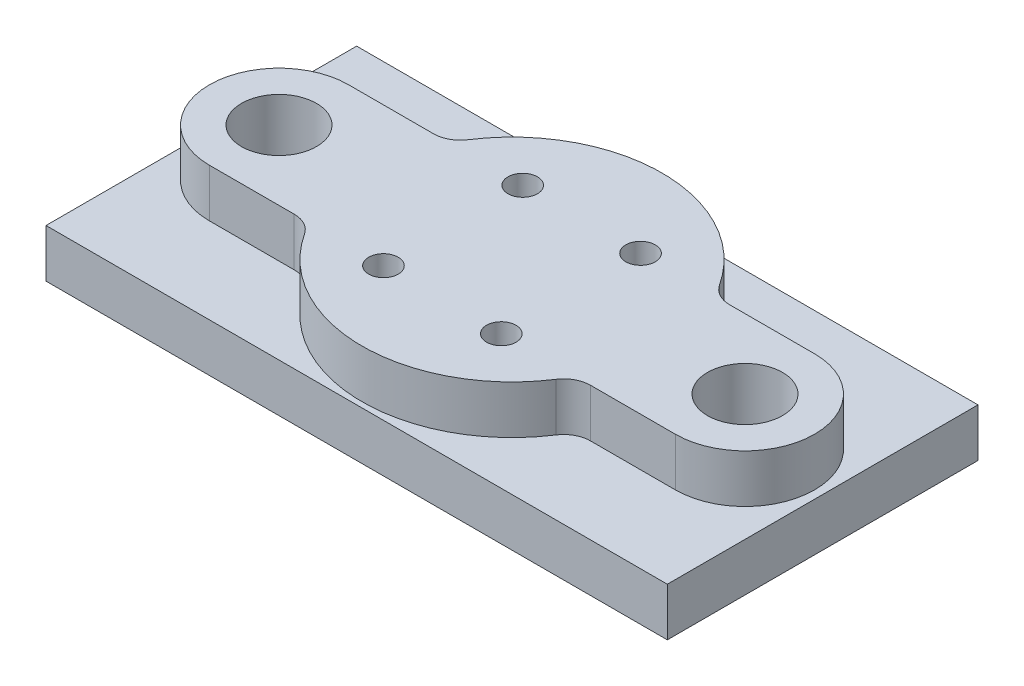
ISO-10303-21;
HEADER;
FILE_DESCRIPTION(('STEP AP214'),'2;1');
FILE_NAME('part.step','',(''),(''),'','','');
FILE_SCHEMA(('AUTOMOTIVE_DESIGN { 1 0 10303 214 1 1 1 1 }'));
ENDSEC;
DATA;
#1=APPLICATION_CONTEXT('core data for automotive mechanical design processes');
#2=APPLICATION_PROTOCOL_DEFINITION('international standard','automotive_design',2000,#1);
#3=PRODUCT_CONTEXT('',#1,'mechanical');
#4=PRODUCT('Part','Part','',(#3));
#5=PRODUCT_RELATED_PRODUCT_CATEGORY('part','',(#4));
#6=PRODUCT_DEFINITION_FORMATION('','',#4);
#7=PRODUCT_DEFINITION_CONTEXT('part definition',#1,'design');
#8=PRODUCT_DEFINITION('design','',#6,#7);
#9=PRODUCT_DEFINITION_SHAPE('','',#8);
#10=(LENGTH_UNIT() NAMED_UNIT(*) SI_UNIT(.MILLI.,.METRE.));
#11=(NAMED_UNIT(*) PLANE_ANGLE_UNIT() SI_UNIT($,.RADIAN.));
#12=(NAMED_UNIT(*) SI_UNIT($,.STERADIAN.) SOLID_ANGLE_UNIT());
#13=UNCERTAINTY_MEASURE_WITH_UNIT(LENGTH_MEASURE(1.E-05),#10,'distance_accuracy_value','');
#14=(GEOMETRIC_REPRESENTATION_CONTEXT(3) GLOBAL_UNCERTAINTY_ASSIGNED_CONTEXT((#13)) GLOBAL_UNIT_ASSIGNED_CONTEXT((#10,
#11,#12)) REPRESENTATION_CONTEXT('',''));
#15=CARTESIAN_POINT('',(0.,0.,0.));
#16=DIRECTION('',(0.,0.,1.));
#17=DIRECTION('',(1.,0.,0.));
#18=AXIS2_PLACEMENT_3D('',#15,#16,#17);
#19=CARTESIAN_POINT('',(-58.,9.,-58.));
#20=DIRECTION('',(-1.,0.,0.));
#21=DIRECTION('',(0.,0.,1.));
#22=AXIS2_PLACEMENT_3D('',#19,#20,#21);
#23=PLANE('',#22);
#24=DIRECTION('',(0.,-1.,0.));
#25=VECTOR('',#24,1.);
#26=CARTESIAN_POINT('',(-58.,9.,0.));
#27=LINE('',#26,#25);
#28=CARTESIAN_POINT('',(-58.,9.,0.));
#29=VERTEX_POINT('',#28);
#30=CARTESIAN_POINT('',(-58.,0.,0.));
#31=VERTEX_POINT('',#30);
#32=EDGE_CURVE('E186',#29,#31,#27,.T.);
#33=ORIENTED_EDGE('',*,*,#32,.F.);
#34=DIRECTION('',(0.,0.,1.));
#35=VECTOR('',#34,1.);
#36=CARTESIAN_POINT('',(-58.,9.,-58.));
#37=LINE('',#36,#35);
#38=CARTESIAN_POINT('',(-58.,9.,-58.));
#39=VERTEX_POINT('',#38);
#40=EDGE_CURVE('E225',#39,#29,#37,.T.);
#41=ORIENTED_EDGE('',*,*,#40,.F.);
#42=DIRECTION('',(0.,-1.,0.));
#43=VECTOR('',#42,1.);
#44=CARTESIAN_POINT('',(-58.,9.,-58.));
#45=LINE('',#44,#43);
#46=CARTESIAN_POINT('',(-58.,0.,-58.));
#47=VERTEX_POINT('',#46);
#48=EDGE_CURVE('E199',#39,#47,#45,.T.);
#49=ORIENTED_EDGE('',*,*,#48,.T.);
#50=DIRECTION('',(0.,0.,1.));
#51=VECTOR('',#50,1.);
#52=CARTESIAN_POINT('',(-58.,0.,-58.));
#53=LINE('',#52,#51);
#54=EDGE_CURVE('E213',#47,#31,#53,.T.);
#55=ORIENTED_EDGE('',*,*,#54,.T.);
#56=EDGE_LOOP('',(#33,#41,#49,#55));
#57=FACE_BOUND('',#56,.T.);
#58=ADVANCED_FACE('F43',(#57),#23,.T.);
#59=CARTESIAN_POINT('',(0.,9.00000000000001,-58.));
#60=DIRECTION('',(0.,1.,0.));
#61=DIRECTION('',(-1.,0.,0.));
#62=AXIS2_PLACEMENT_3D('',#59,#60,#61);
#63=PLANE('',#62);
#64=DIRECTION('',(-1.,0.,0.));
#65=VECTOR('',#64,1.);
#66=CARTESIAN_POINT('',(-43.5,9.00000000000001,-42.));
#67=LINE('',#66,#65);
#68=CARTESIAN_POINT('',(-27.6586333718787,9.00000000000001,-42.));
#69=VERTEX_POINT('',#68);
#70=CARTESIAN_POINT('',(-43.5,9.00000000000001,-42.));
#71=VERTEX_POINT('',#70);
#72=EDGE_CURVE('E313',#69,#71,#67,.T.);
#73=ORIENTED_EDGE('',*,*,#72,.F.);
#74=CARTESIAN_POINT('',(-27.6586333718787,9.,-47.));
#75=DIRECTION('',(0.,1.,0.));
#76=DIRECTION('',(-1.,0.,0.));
#77=AXIS2_PLACEMENT_3D('',#74,#75,#76);
#78=CIRCLE('',#77,5.);
#79=CARTESIAN_POINT('',(-23.4679313458364,9.00000000000001,-44.2727272727273));
#80=VERTEX_POINT('',#79);
#81=EDGE_CURVE('E251',#69,#80,#78,.T.);
#82=ORIENTED_EDGE('',*,*,#81,.T.);
#83=CARTESIAN_POINT('',(0.,9.00000000000001,-29.));
#84=DIRECTION('',(0.,1.,0.));
#85=DIRECTION('',(0.,0.,1.));
#86=AXIS2_PLACEMENT_3D('',#83,#84,#85);
#87=CIRCLE('',#86,28.);
#88=CARTESIAN_POINT('',(23.4679313458364,9.00000000000001,-44.2727272727273));
#89=VERTEX_POINT('',#88);
#90=EDGE_CURVE('E344',#89,#80,#87,.T.);
#91=ORIENTED_EDGE('',*,*,#90,.F.);
#92=CARTESIAN_POINT('',(27.6586333718787,9.00000000000001,-47.));
#93=DIRECTION('',(0.,1.,0.));
#94=DIRECTION('',(-1.,0.,0.));
#95=AXIS2_PLACEMENT_3D('',#92,#93,#94);
#96=CIRCLE('',#95,5.);
#97=CARTESIAN_POINT('',(27.6586333718787,9.00000000000001,-42.));
#98=VERTEX_POINT('',#97);
#99=EDGE_CURVE('E248',#89,#98,#96,.T.);
#100=ORIENTED_EDGE('',*,*,#99,.T.);
#101=DIRECTION('',(-1.,0.,0.));
#102=VECTOR('',#101,1.);
#103=CARTESIAN_POINT('',(43.5,9.00000000000001,-42.));
#104=LINE('',#103,#102);
#105=CARTESIAN_POINT('',(43.5,9.00000000000001,-42.));
#106=VERTEX_POINT('',#105);
#107=EDGE_CURVE('E340',#106,#98,#104,.T.);
#108=ORIENTED_EDGE('',*,*,#107,.F.);
#109=CARTESIAN_POINT('',(43.5,9.00000000000001,-29.));
#110=DIRECTION('',(0.,1.,0.));
#111=DIRECTION('',(0.,0.,-1.));
#112=AXIS2_PLACEMENT_3D('',#109,#110,#111);
#113=CIRCLE('',#112,13.);
#114=CARTESIAN_POINT('',(43.5,9.00000000000001,-16.));
#115=VERTEX_POINT('',#114);
#116=EDGE_CURVE('E184',#115,#106,#113,.T.);
#117=ORIENTED_EDGE('',*,*,#116,.F.);
#118=DIRECTION('',(1.,0.,0.));
#119=VECTOR('',#118,1.);
#120=CARTESIAN_POINT('',(43.5,9.00000000000001,-16.));
#121=LINE('',#120,#119);
#122=CARTESIAN_POINT('',(27.6586333718787,9.00000000000001,-16.));
#123=VERTEX_POINT('',#122);
#124=EDGE_CURVE('E180',#123,#115,#121,.T.);
#125=ORIENTED_EDGE('',*,*,#124,.F.);
#126=CARTESIAN_POINT('',(27.6586333718787,9.00000000000001,-11.));
#127=DIRECTION('',(0.,1.,0.));
#128=DIRECTION('',(-1.,0.,0.));
#129=AXIS2_PLACEMENT_3D('',#126,#127,#128);
#130=CIRCLE('',#129,5.);
#131=CARTESIAN_POINT('',(23.4679313458364,9.00000000000001,-13.7272727272727));
#132=VERTEX_POINT('',#131);
#133=EDGE_CURVE('E242',#123,#132,#130,.T.);
#134=ORIENTED_EDGE('',*,*,#133,.T.);
#135=CARTESIAN_POINT('',(0.,9.00000000000001,-29.));
#136=DIRECTION('',(0.,1.,0.));
#137=DIRECTION('',(0.,0.,1.));
#138=AXIS2_PLACEMENT_3D('',#135,#136,#137);
#139=CIRCLE('',#138,28.);
#140=CARTESIAN_POINT('',(-23.4679313458364,9.00000000000001,-13.7272727272727));
#141=VERTEX_POINT('',#140);
#142=EDGE_CURVE('E303',#141,#132,#139,.T.);
#143=ORIENTED_EDGE('',*,*,#142,.F.);
#144=CARTESIAN_POINT('',(-27.6586333718787,9.,-11.));
#145=DIRECTION('',(0.,1.,0.));
#146=DIRECTION('',(-1.,0.,0.));
#147=AXIS2_PLACEMENT_3D('',#144,#145,#146);
#148=CIRCLE('',#147,5.);
#149=CARTESIAN_POINT('',(-27.6586333718787,9.00000000000001,-16.));
#150=VERTEX_POINT('',#149);
#151=EDGE_CURVE('E245',#141,#150,#148,.T.);
#152=ORIENTED_EDGE('',*,*,#151,.T.);
#153=DIRECTION('',(1.,0.,0.));
#154=VECTOR('',#153,1.);
#155=CARTESIAN_POINT('',(-43.5,9.00000000000001,-16.));
#156=LINE('',#155,#154);
#157=CARTESIAN_POINT('',(-43.5,9.00000000000001,-16.));
#158=VERTEX_POINT('',#157);
#159=EDGE_CURVE('E301',#158,#150,#156,.T.);
#160=ORIENTED_EDGE('',*,*,#159,.F.);
#161=CARTESIAN_POINT('',(-43.5,9.00000000000001,-29.));
#162=DIRECTION('',(0.,1.,0.));
#163=DIRECTION('',(0.,0.,-1.));
#164=AXIS2_PLACEMENT_3D('',#161,#162,#163);
#165=CIRCLE('',#164,13.);
#166=EDGE_CURVE('E308',#71,#158,#165,.T.);
#167=ORIENTED_EDGE('',*,*,#166,.F.);
#168=EDGE_LOOP('',(#73,#82,#91,#100,#108,#117,#125,#134,#143,#152,#160,#167));
#169=FACE_BOUND('',#168,.T.);
#170=DIRECTION('',(-1.,0.,0.));
#171=VECTOR('',#170,1.);
#172=CARTESIAN_POINT('',(0.,9.00000000000001,0.));
#173=LINE('',#172,#171);
#174=CARTESIAN_POINT('',(58.,9.00000000000001,0.));
#175=VERTEX_POINT('',#174);
#176=EDGE_CURVE('E204',#175,#29,#173,.T.);
#177=ORIENTED_EDGE('',*,*,#176,.F.);
#178=DIRECTION('',(0.,0.,1.));
#179=VECTOR('',#178,1.);
#180=CARTESIAN_POINT('',(58.,9.00000000000001,-58.));
#181=LINE('',#180,#179);
#182=CARTESIAN_POINT('',(58.,9.00000000000001,-58.));
#183=VERTEX_POINT('',#182);
#184=EDGE_CURVE('E229',#183,#175,#181,.T.);
#185=ORIENTED_EDGE('',*,*,#184,.F.);
#186=DIRECTION('',(-1.,0.,0.));
#187=VECTOR('',#186,1.);
#188=CARTESIAN_POINT('',(58.,9.00000000000001,-58.));
#189=LINE('',#188,#187);
#190=EDGE_CURVE('E211',#183,#39,#189,.T.);
#191=ORIENTED_EDGE('',*,*,#190,.T.);
#192=ORIENTED_EDGE('',*,*,#40,.T.);
#193=EDGE_LOOP('',(#177,#185,#191,#192));
#194=FACE_BOUND('',#193,.T.);
#195=ADVANCED_FACE('F298',(#169,#194),#63,.T.);
#196=CARTESIAN_POINT('',(58.,0.,-58.));
#197=DIRECTION('',(1.,0.,0.));
#198=DIRECTION('',(0.,1.,0.));
#199=AXIS2_PLACEMENT_3D('',#196,#197,#198);
#200=PLANE('',#199);
#201=DIRECTION('',(0.,1.,0.));
#202=VECTOR('',#201,1.);
#203=CARTESIAN_POINT('',(58.,0.,0.));
#204=LINE('',#203,#202);
#205=CARTESIAN_POINT('',(58.,0.,0.));
#206=VERTEX_POINT('',#205);
#207=EDGE_CURVE('E218',#206,#175,#204,.T.);
#208=ORIENTED_EDGE('',*,*,#207,.F.);
#209=DIRECTION('',(0.,0.,1.));
#210=VECTOR('',#209,1.);
#211=CARTESIAN_POINT('',(58.,0.,-58.));
#212=LINE('',#211,#210);
#213=CARTESIAN_POINT('',(58.,0.,-58.));
#214=VERTEX_POINT('',#213);
#215=EDGE_CURVE('E233',#214,#206,#212,.T.);
#216=ORIENTED_EDGE('',*,*,#215,.F.);
#217=DIRECTION('',(0.,1.,0.));
#218=VECTOR('',#217,1.);
#219=CARTESIAN_POINT('',(58.,0.,-58.));
#220=LINE('',#219,#218);
#221=EDGE_CURVE('E207',#214,#183,#220,.T.);
#222=ORIENTED_EDGE('',*,*,#221,.T.);
#223=ORIENTED_EDGE('',*,*,#184,.T.);
#224=EDGE_LOOP('',(#208,#216,#222,#223));
#225=FACE_BOUND('',#224,.T.);
#226=ADVANCED_FACE('F385',(#225),#200,.T.);
#227=CARTESIAN_POINT('',(0.,0.,-58.));
#228=DIRECTION('',(0.,-1.,0.));
#229=DIRECTION('',(0.,0.,-1.));
#230=AXIS2_PLACEMENT_3D('',#227,#228,#229);
#231=PLANE('',#230);
#232=CARTESIAN_POINT('',(11.,0.,-42.));
#233=DIRECTION('',(0.,-1.,0.));
#234=DIRECTION('',(0.,0.,-1.));
#235=AXIS2_PLACEMENT_3D('',#232,#233,#234);
#236=CIRCLE('',#235,4.75);
#237=CARTESIAN_POINT('',(11.,0.,-46.75));
#238=VERTEX_POINT('',#237);
#239=EDGE_CURVE('E759',#238,#238,#236,.T.);
#240=ORIENTED_EDGE('',*,*,#239,.F.);
#241=EDGE_LOOP('',(#240));
#242=FACE_BOUND('',#241,.T.);
#243=CARTESIAN_POINT('',(11.,0.,-16.));
#244=DIRECTION('',(0.,-1.,0.));
#245=DIRECTION('',(0.,0.,-1.));
#246=AXIS2_PLACEMENT_3D('',#243,#244,#245);
#247=CIRCLE('',#246,4.75);
#248=CARTESIAN_POINT('',(11.,0.,-20.75));
#249=VERTEX_POINT('',#248);
#250=EDGE_CURVE('E764',#249,#249,#247,.T.);
#251=ORIENTED_EDGE('',*,*,#250,.F.);
#252=EDGE_LOOP('',(#251));
#253=FACE_BOUND('',#252,.T.);
#254=CARTESIAN_POINT('',(-11.,0.,-16.));
#255=DIRECTION('',(0.,-1.,0.));
#256=DIRECTION('',(0.,0.,-1.));
#257=AXIS2_PLACEMENT_3D('',#254,#255,#256);
#258=CIRCLE('',#257,4.75);
#259=CARTESIAN_POINT('',(-11.,0.,-20.75));
#260=VERTEX_POINT('',#259);
#261=EDGE_CURVE('E788',#260,#260,#258,.T.);
#262=ORIENTED_EDGE('',*,*,#261,.F.);
#263=EDGE_LOOP('',(#262));
#264=FACE_BOUND('',#263,.T.);
#265=CARTESIAN_POINT('',(-11.,0.,-42.));
#266=DIRECTION('',(0.,-1.,0.));
#267=DIRECTION('',(0.,0.,-1.));
#268=AXIS2_PLACEMENT_3D('',#265,#266,#267);
#269=CIRCLE('',#268,4.75);
#270=CARTESIAN_POINT('',(-11.,0.,-46.75));
#271=VERTEX_POINT('',#270);
#272=EDGE_CURVE('E778',#271,#271,#269,.T.);
#273=ORIENTED_EDGE('',*,*,#272,.F.);
#274=EDGE_LOOP('',(#273));
#275=FACE_BOUND('',#274,.T.);
#276=CARTESIAN_POINT('',(-43.5,0.,-29.));
#277=DIRECTION('',(0.,1.,0.));
#278=DIRECTION('',(0.,0.,1.));
#279=AXIS2_PLACEMENT_3D('',#276,#277,#278);
#280=CIRCLE('',#279,6.99999999999999);
#281=CARTESIAN_POINT('',(-43.5,0.,-22.));
#282=VERTEX_POINT('',#281);
#283=EDGE_CURVE('E809',#282,#282,#280,.T.);
#284=ORIENTED_EDGE('',*,*,#283,.T.);
#285=EDGE_LOOP('',(#284));
#286=FACE_BOUND('',#285,.T.);
#287=CARTESIAN_POINT('',(43.5,0.,-29.));
#288=DIRECTION('',(0.,1.,0.));
#289=DIRECTION('',(0.,0.,1.));
#290=AXIS2_PLACEMENT_3D('',#287,#288,#289);
#291=CIRCLE('',#290,6.99999999999999);
#292=CARTESIAN_POINT('',(43.5,0.,-22.));
#293=VERTEX_POINT('',#292);
#294=EDGE_CURVE('E801',#293,#293,#291,.T.);
#295=ORIENTED_EDGE('',*,*,#294,.T.);
#296=EDGE_LOOP('',(#295));
#297=FACE_BOUND('',#296,.T.);
#298=DIRECTION('',(1.,0.,0.));
#299=VECTOR('',#298,1.);
#300=CARTESIAN_POINT('',(0.,0.,0.));
#301=LINE('',#300,#299);
#302=EDGE_CURVE('E192',#31,#206,#301,.T.);
#303=ORIENTED_EDGE('',*,*,#302,.F.);
#304=ORIENTED_EDGE('',*,*,#54,.F.);
#305=DIRECTION('',(1.,0.,0.));
#306=VECTOR('',#305,1.);
#307=CARTESIAN_POINT('',(-58.,0.,-58.));
#308=LINE('',#307,#306);
#309=EDGE_CURVE('E203',#47,#214,#308,.T.);
#310=ORIENTED_EDGE('',*,*,#309,.T.);
#311=ORIENTED_EDGE('',*,*,#215,.T.);
#312=EDGE_LOOP('',(#303,#304,#310,#311));
#313=FACE_BOUND('',#312,.T.);
#314=ADVANCED_FACE('F390',(#242,#253,#264,#275,#286,#297,#313),#231,.T.);
#315=CARTESIAN_POINT('',(0.,0.,-58.));
#316=DIRECTION('',(0.,0.,1.));
#317=DIRECTION('',(1.,0.,0.));
#318=AXIS2_PLACEMENT_3D('',#315,#316,#317);
#319=PLANE('',#318);
#320=ORIENTED_EDGE('',*,*,#48,.F.);
#321=ORIENTED_EDGE('',*,*,#190,.F.);
#322=ORIENTED_EDGE('',*,*,#221,.F.);
#323=ORIENTED_EDGE('',*,*,#309,.F.);
#324=EDGE_LOOP('',(#320,#321,#322,#323));
#325=FACE_BOUND('',#324,.T.);
#326=ADVANCED_FACE('F455',(#325),#319,.F.);
#327=CARTESIAN_POINT('',(0.,0.,0.));
#328=DIRECTION('',(0.,0.,1.));
#329=DIRECTION('',(1.,0.,0.));
#330=AXIS2_PLACEMENT_3D('',#327,#328,#329);
#331=PLANE('',#330);
#332=ORIENTED_EDGE('',*,*,#32,.T.);
#333=ORIENTED_EDGE('',*,*,#302,.T.);
#334=ORIENTED_EDGE('',*,*,#207,.T.);
#335=ORIENTED_EDGE('',*,*,#176,.T.);
#336=EDGE_LOOP('',(#332,#333,#334,#335));
#337=FACE_BOUND('',#336,.T.);
#338=ADVANCED_FACE('F421',(#337),#331,.T.);
#339=CARTESIAN_POINT('',(43.5,18.,-29.));
#340=DIRECTION('',(0.,-1.,0.));
#341=DIRECTION('',(0.,0.,-1.));
#342=AXIS2_PLACEMENT_3D('',#339,#340,#341);
#343=PLANE('',#342);
#344=CARTESIAN_POINT('',(-43.5,18.,-29.));
#345=DIRECTION('',(0.,1.,0.));
#346=DIRECTION('',(0.,0.,1.));
#347=AXIS2_PLACEMENT_3D('',#344,#345,#346);
#348=CIRCLE('',#347,6.99999999999999);
#349=CARTESIAN_POINT('',(-43.5,18.,-22.));
#350=VERTEX_POINT('',#349);
#351=EDGE_CURVE('E777',#350,#350,#348,.T.);
#352=ORIENTED_EDGE('',*,*,#351,.F.);
#353=EDGE_LOOP('',(#352));
#354=FACE_BOUND('',#353,.T.);
#355=CARTESIAN_POINT('',(43.5,18.,-29.));
#356=DIRECTION('',(0.,1.,0.));
#357=DIRECTION('',(0.,0.,1.));
#358=AXIS2_PLACEMENT_3D('',#355,#356,#357);
#359=CIRCLE('',#358,6.99999999999999);
#360=CARTESIAN_POINT('',(43.5,18.,-22.));
#361=VERTEX_POINT('',#360);
#362=EDGE_CURVE('E805',#361,#361,#359,.T.);
#363=ORIENTED_EDGE('',*,*,#362,.F.);
#364=EDGE_LOOP('',(#363));
#365=FACE_BOUND('',#364,.T.);
#366=CARTESIAN_POINT('',(43.5,18.,-29.));
#367=DIRECTION('',(0.,1.,0.));
#368=DIRECTION('',(0.,0.,-1.));
#369=AXIS2_PLACEMENT_3D('',#366,#367,#368);
#370=CIRCLE('',#369,13.);
#371=CARTESIAN_POINT('',(43.5,18.,-16.));
#372=VERTEX_POINT('',#371);
#373=CARTESIAN_POINT('',(43.5,18.,-42.));
#374=VERTEX_POINT('',#373);
#375=EDGE_CURVE('E170',#372,#374,#370,.T.);
#376=ORIENTED_EDGE('',*,*,#375,.T.);
#377=DIRECTION('',(-1.,0.,0.));
#378=VECTOR('',#377,1.);
#379=CARTESIAN_POINT('',(43.5,18.,-42.));
#380=LINE('',#379,#378);
#381=CARTESIAN_POINT('',(27.6586333718787,18.,-42.));
#382=VERTEX_POINT('',#381);
#383=EDGE_CURVE('E158',#374,#382,#380,.T.);
#384=ORIENTED_EDGE('',*,*,#383,.T.);
#385=CARTESIAN_POINT('',(27.6586333718787,18.,-47.));
#386=DIRECTION('',(0.,-1.,0.));
#387=DIRECTION('',(0.,0.,-1.));
#388=AXIS2_PLACEMENT_3D('',#385,#386,#387);
#389=CIRCLE('',#388,5.);
#390=CARTESIAN_POINT('',(23.4679313458364,18.,-44.2727272727273));
#391=VERTEX_POINT('',#390);
#392=EDGE_CURVE('E279',#382,#391,#389,.T.);
#393=ORIENTED_EDGE('',*,*,#392,.T.);
#394=CARTESIAN_POINT('',(0.,18.,-29.));
#395=DIRECTION('',(0.,1.,0.));
#396=DIRECTION('',(0.,0.,1.));
#397=AXIS2_PLACEMENT_3D('',#394,#395,#396);
#398=CIRCLE('',#397,28.);
#399=CARTESIAN_POINT('',(-23.4679313458364,18.,-44.2727272727273));
#400=VERTEX_POINT('',#399);
#401=EDGE_CURVE('E169',#391,#400,#398,.T.);
#402=ORIENTED_EDGE('',*,*,#401,.T.);
#403=CARTESIAN_POINT('',(-27.6586333718787,18.,-47.));
#404=DIRECTION('',(0.,-1.,0.));
#405=DIRECTION('',(0.,0.,-1.));
#406=AXIS2_PLACEMENT_3D('',#403,#404,#405);
#407=CIRCLE('',#406,5.);
#408=CARTESIAN_POINT('',(-27.6586333718787,18.,-42.));
#409=VERTEX_POINT('',#408);
#410=EDGE_CURVE('E276',#400,#409,#407,.T.);
#411=ORIENTED_EDGE('',*,*,#410,.T.);
#412=DIRECTION('',(-1.,0.,0.));
#413=VECTOR('',#412,1.);
#414=CARTESIAN_POINT('',(-43.5,18.,-42.));
#415=LINE('',#414,#413);
#416=CARTESIAN_POINT('',(-43.5,18.,-42.));
#417=VERTEX_POINT('',#416);
#418=EDGE_CURVE('E329',#409,#417,#415,.T.);
#419=ORIENTED_EDGE('',*,*,#418,.T.);
#420=CARTESIAN_POINT('',(-43.5,18.,-29.));
#421=DIRECTION('',(0.,1.,0.));
#422=DIRECTION('',(0.,0.,-1.));
#423=AXIS2_PLACEMENT_3D('',#420,#421,#422);
#424=CIRCLE('',#423,13.);
#425=CARTESIAN_POINT('',(-43.5,18.,-16.));
#426=VERTEX_POINT('',#425);
#427=EDGE_CURVE('E326',#417,#426,#424,.T.);
#428=ORIENTED_EDGE('',*,*,#427,.T.);
#429=DIRECTION('',(1.,0.,0.));
#430=VECTOR('',#429,1.);
#431=CARTESIAN_POINT('',(-43.5,18.,-16.));
#432=LINE('',#431,#430);
#433=CARTESIAN_POINT('',(-27.6586333718787,18.,-16.));
#434=VERTEX_POINT('',#433);
#435=EDGE_CURVE('E285',#426,#434,#432,.T.);
#436=ORIENTED_EDGE('',*,*,#435,.T.);
#437=CARTESIAN_POINT('',(-27.6586333718787,18.,-11.));
#438=DIRECTION('',(0.,-1.,0.));
#439=DIRECTION('',(0.,0.,-1.));
#440=AXIS2_PLACEMENT_3D('',#437,#438,#439);
#441=CIRCLE('',#440,5.);
#442=CARTESIAN_POINT('',(-23.4679313458364,18.,-13.7272727272727));
#443=VERTEX_POINT('',#442);
#444=EDGE_CURVE('E52',#434,#443,#441,.T.);
#445=ORIENTED_EDGE('',*,*,#444,.T.);
#446=CARTESIAN_POINT('',(0.,18.,-29.));
#447=DIRECTION('',(0.,1.,0.));
#448=DIRECTION('',(0.,0.,1.));
#449=AXIS2_PLACEMENT_3D('',#446,#447,#448);
#450=CIRCLE('',#449,28.);
#451=CARTESIAN_POINT('',(23.4679313458364,18.,-13.7272727272727));
#452=VERTEX_POINT('',#451);
#453=EDGE_CURVE('E284',#443,#452,#450,.T.);
#454=ORIENTED_EDGE('',*,*,#453,.T.);
#455=CARTESIAN_POINT('',(27.6586333718787,18.,-11.));
#456=DIRECTION('',(0.,-1.,0.));
#457=DIRECTION('',(0.,0.,-1.));
#458=AXIS2_PLACEMENT_3D('',#455,#456,#457);
#459=CIRCLE('',#458,5.);
#460=CARTESIAN_POINT('',(27.6586333718787,18.,-16.));
#461=VERTEX_POINT('',#460);
#462=EDGE_CURVE('E11',#452,#461,#459,.T.);
#463=ORIENTED_EDGE('',*,*,#462,.T.);
#464=DIRECTION('',(1.,0.,0.));
#465=VECTOR('',#464,1.);
#466=CARTESIAN_POINT('',(43.5,18.,-16.));
#467=LINE('',#466,#465);
#468=EDGE_CURVE('E175',#461,#372,#467,.T.);
#469=ORIENTED_EDGE('',*,*,#468,.T.);
#470=EDGE_LOOP('',(#376,#384,#393,#402,#411,#419,#428,#436,#445,#454,#463,#469));
#471=FACE_BOUND('',#470,.T.);
#472=CARTESIAN_POINT('',(11.,18.,-42.));
#473=DIRECTION('',(0.,1.,0.));
#474=DIRECTION('',(0.,0.,1.));
#475=AXIS2_PLACEMENT_3D('',#472,#473,#474);
#476=CIRCLE('',#475,2.75);
#477=CARTESIAN_POINT('',(11.,18.,-39.25));
#478=VERTEX_POINT('',#477);
#479=EDGE_CURVE('E341',#478,#478,#476,.T.);
#480=ORIENTED_EDGE('',*,*,#479,.F.);
#481=EDGE_LOOP('',(#480));
#482=FACE_BOUND('',#481,.T.);
#483=CARTESIAN_POINT('',(-11.,18.,-42.));
#484=DIRECTION('',(0.,1.,0.));
#485=DIRECTION('',(0.,0.,1.));
#486=AXIS2_PLACEMENT_3D('',#483,#484,#485);
#487=CIRCLE('',#486,2.75);
#488=CARTESIAN_POINT('',(-11.,18.,-39.25));
#489=VERTEX_POINT('',#488);
#490=EDGE_CURVE('E772',#489,#489,#487,.T.);
#491=ORIENTED_EDGE('',*,*,#490,.F.);
#492=EDGE_LOOP('',(#491));
#493=FACE_BOUND('',#492,.T.);
#494=CARTESIAN_POINT('',(-11.,18.,-16.));
#495=DIRECTION('',(0.,1.,0.));
#496=DIRECTION('',(0.,0.,1.));
#497=AXIS2_PLACEMENT_3D('',#494,#495,#496);
#498=CIRCLE('',#497,2.75);
#499=CARTESIAN_POINT('',(-11.,18.,-13.25));
#500=VERTEX_POINT('',#499);
#501=EDGE_CURVE('E782',#500,#500,#498,.T.);
#502=ORIENTED_EDGE('',*,*,#501,.F.);
#503=EDGE_LOOP('',(#502));
#504=FACE_BOUND('',#503,.T.);
#505=CARTESIAN_POINT('',(11.,18.,-16.));
#506=DIRECTION('',(0.,1.,0.));
#507=DIRECTION('',(0.,0.,1.));
#508=AXIS2_PLACEMENT_3D('',#505,#506,#507);
#509=CIRCLE('',#508,2.75);
#510=CARTESIAN_POINT('',(11.,18.,-13.25));
#511=VERTEX_POINT('',#510);
#512=EDGE_CURVE('E792',#511,#511,#509,.T.);
#513=ORIENTED_EDGE('',*,*,#512,.F.);
#514=EDGE_LOOP('',(#513));
#515=FACE_BOUND('',#514,.T.);
#516=ADVANCED_FACE('F173',(#354,#365,#471,#482,#493,#504,#515),#343,.F.);
#517=CARTESIAN_POINT('',(43.5,18.,-29.));
#518=DIRECTION('',(0.,-1.,0.));
#519=DIRECTION('',(0.,0.,-1.));
#520=AXIS2_PLACEMENT_3D('',#517,#518,#519);
#521=CYLINDRICAL_SURFACE('',#520,13.);
#522=ORIENTED_EDGE('',*,*,#116,.T.);
#523=DIRECTION('',(0.,-1.,0.));
#524=VECTOR('',#523,1.);
#525=CARTESIAN_POINT('',(43.5,18.,-42.));
#526=LINE('',#525,#524);
#527=EDGE_CURVE('E163',#374,#106,#526,.T.);
#528=ORIENTED_EDGE('',*,*,#527,.F.);
#529=ORIENTED_EDGE('',*,*,#375,.F.);
#530=DIRECTION('',(0.,-1.,0.));
#531=VECTOR('',#530,1.);
#532=CARTESIAN_POINT('',(43.5,18.,-16.));
#533=LINE('',#532,#531);
#534=EDGE_CURVE('E319',#372,#115,#533,.T.);
#535=ORIENTED_EDGE('',*,*,#534,.T.);
#536=EDGE_LOOP('',(#522,#528,#529,#535));
#537=FACE_BOUND('',#536,.T.);
#538=ADVANCED_FACE('F182',(#537),#521,.T.);
#539=CARTESIAN_POINT('',(43.5,18.,-42.));
#540=DIRECTION('',(0.,0.,1.));
#541=DIRECTION('',(1.,0.,0.));
#542=AXIS2_PLACEMENT_3D('',#539,#540,#541);
#543=PLANE('',#542);
#544=ORIENTED_EDGE('',*,*,#107,.T.);
#545=DIRECTION('',(0.,1.,0.));
#546=VECTOR('',#545,1.);
#547=CARTESIAN_POINT('',(27.6586333718787,18.,-42.));
#548=LINE('',#547,#546);
#549=EDGE_CURVE('E166',#98,#382,#548,.T.);
#550=ORIENTED_EDGE('',*,*,#549,.T.);
#551=ORIENTED_EDGE('',*,*,#383,.F.);
#552=ORIENTED_EDGE('',*,*,#527,.T.);
#553=EDGE_LOOP('',(#544,#550,#551,#552));
#554=FACE_BOUND('',#553,.T.);
#555=ADVANCED_FACE('F161',(#554),#543,.F.);
#556=CARTESIAN_POINT('',(0.,18.,-29.));
#557=DIRECTION('',(0.,-1.,0.));
#558=DIRECTION('',(0.,0.,-1.));
#559=AXIS2_PLACEMENT_3D('',#556,#557,#558);
#560=CYLINDRICAL_SURFACE('',#559,28.);
#561=ORIENTED_EDGE('',*,*,#90,.T.);
#562=DIRECTION('',(0.,-1.,0.));
#563=VECTOR('',#562,1.);
#564=CARTESIAN_POINT('',(-23.4679313458365,18.,-44.2727272727273));
#565=LINE('',#564,#563);
#566=EDGE_CURVE('E258',#80,#400,#565,.F.);
#567=ORIENTED_EDGE('',*,*,#566,.T.);
#568=ORIENTED_EDGE('',*,*,#401,.F.);
#569=DIRECTION('',(0.,-1.,0.));
#570=VECTOR('',#569,1.);
#571=CARTESIAN_POINT('',(23.4679313458364,18.,-44.2727272727273));
#572=LINE('',#571,#570);
#573=EDGE_CURVE('E254',#391,#89,#572,.T.);
#574=ORIENTED_EDGE('',*,*,#573,.T.);
#575=EDGE_LOOP('',(#561,#567,#568,#574));
#576=FACE_BOUND('',#575,.T.);
#577=ADVANCED_FACE('F361',(#576),#560,.T.);
#578=CARTESIAN_POINT('',(-43.5,18.,-42.));
#579=DIRECTION('',(0.,0.,1.));
#580=DIRECTION('',(1.,0.,0.));
#581=AXIS2_PLACEMENT_3D('',#578,#579,#580);
#582=PLANE('',#581);
#583=ORIENTED_EDGE('',*,*,#418,.F.);
#584=DIRECTION('',(0.,1.,0.));
#585=VECTOR('',#584,1.);
#586=CARTESIAN_POINT('',(-27.6586333718787,9.00000000000001,-42.));
#587=LINE('',#586,#585);
#588=EDGE_CURVE('E228',#409,#69,#587,.F.);
#589=ORIENTED_EDGE('',*,*,#588,.T.);
#590=ORIENTED_EDGE('',*,*,#72,.T.);
#591=DIRECTION('',(0.,-1.,0.));
#592=VECTOR('',#591,1.);
#593=CARTESIAN_POINT('',(-43.5,18.,-42.));
#594=LINE('',#593,#592);
#595=EDGE_CURVE('E187',#417,#71,#594,.T.);
#596=ORIENTED_EDGE('',*,*,#595,.F.);
#597=EDGE_LOOP('',(#583,#589,#590,#596));
#598=FACE_BOUND('',#597,.T.);
#599=ADVANCED_FACE('F351',(#598),#582,.F.);
#600=CARTESIAN_POINT('',(-43.5,18.,-29.));
#601=DIRECTION('',(0.,-1.,0.));
#602=DIRECTION('',(0.,0.,-1.));
#603=AXIS2_PLACEMENT_3D('',#600,#601,#602);
#604=CYLINDRICAL_SURFACE('',#603,13.);
#605=ORIENTED_EDGE('',*,*,#166,.T.);
#606=DIRECTION('',(0.,-1.,0.));
#607=VECTOR('',#606,1.);
#608=CARTESIAN_POINT('',(-43.5,18.,-16.));
#609=LINE('',#608,#607);
#610=EDGE_CURVE('E195',#426,#158,#609,.T.);
#611=ORIENTED_EDGE('',*,*,#610,.F.);
#612=ORIENTED_EDGE('',*,*,#427,.F.);
#613=ORIENTED_EDGE('',*,*,#595,.T.);
#614=EDGE_LOOP('',(#605,#611,#612,#613));
#615=FACE_BOUND('',#614,.T.);
#616=ADVANCED_FACE('F355',(#615),#604,.T.);
#617=CARTESIAN_POINT('',(-43.5,18.,-16.));
#618=DIRECTION('',(0.,0.,-1.));
#619=DIRECTION('',(-1.,0.,0.));
#620=AXIS2_PLACEMENT_3D('',#617,#618,#619);
#621=PLANE('',#620);
#622=ORIENTED_EDGE('',*,*,#159,.T.);
#623=DIRECTION('',(0.,1.,0.));
#624=VECTOR('',#623,1.);
#625=CARTESIAN_POINT('',(-27.6586333718787,18.,-16.));
#626=LINE('',#625,#624);
#627=EDGE_CURVE('E65',#150,#434,#626,.T.);
#628=ORIENTED_EDGE('',*,*,#627,.T.);
#629=ORIENTED_EDGE('',*,*,#435,.F.);
#630=ORIENTED_EDGE('',*,*,#610,.T.);
#631=EDGE_LOOP('',(#622,#628,#629,#630));
#632=FACE_BOUND('',#631,.T.);
#633=ADVANCED_FACE('F305',(#632),#621,.F.);
#634=CARTESIAN_POINT('',(0.,18.,-29.));
#635=DIRECTION('',(0.,-1.,0.));
#636=DIRECTION('',(0.,0.,-1.));
#637=AXIS2_PLACEMENT_3D('',#634,#635,#636);
#638=CYLINDRICAL_SURFACE('',#637,28.);
#639=ORIENTED_EDGE('',*,*,#453,.F.);
#640=DIRECTION('',(0.,-1.,0.));
#641=VECTOR('',#640,1.);
#642=CARTESIAN_POINT('',(-23.4679313458364,18.,-13.7272727272727));
#643=LINE('',#642,#641);
#644=EDGE_CURVE('E266',#443,#141,#643,.T.);
#645=ORIENTED_EDGE('',*,*,#644,.T.);
#646=ORIENTED_EDGE('',*,*,#142,.T.);
#647=DIRECTION('',(0.,-1.,0.));
#648=VECTOR('',#647,1.);
#649=CARTESIAN_POINT('',(23.4679313458364,18.,-13.7272727272727));
#650=LINE('',#649,#648);
#651=EDGE_CURVE('E263',#132,#452,#650,.F.);
#652=ORIENTED_EDGE('',*,*,#651,.T.);
#653=EDGE_LOOP('',(#639,#645,#646,#652));
#654=FACE_BOUND('',#653,.T.);
#655=ADVANCED_FACE('F289',(#654),#638,.T.);
#656=CARTESIAN_POINT('',(43.5,18.,-16.));
#657=DIRECTION('',(0.,0.,-1.));
#658=DIRECTION('',(-1.,0.,0.));
#659=AXIS2_PLACEMENT_3D('',#656,#657,#658);
#660=PLANE('',#659);
#661=ORIENTED_EDGE('',*,*,#468,.F.);
#662=DIRECTION('',(0.,1.,0.));
#663=VECTOR('',#662,1.);
#664=CARTESIAN_POINT('',(27.6586333718787,9.00000000000001,-16.));
#665=LINE('',#664,#663);
#666=EDGE_CURVE('E272',#461,#123,#665,.F.);
#667=ORIENTED_EDGE('',*,*,#666,.T.);
#668=ORIENTED_EDGE('',*,*,#124,.T.);
#669=ORIENTED_EDGE('',*,*,#534,.F.);
#670=EDGE_LOOP('',(#661,#667,#668,#669));
#671=FACE_BOUND('',#670,.T.);
#672=ADVANCED_FACE('F367',(#671),#660,.F.);
#673=CARTESIAN_POINT('',(11.,18.,-42.));
#674=DIRECTION('',(0.,-1.,0.));
#675=DIRECTION('',(0.,0.,-1.));
#676=AXIS2_PLACEMENT_3D('',#673,#674,#675);
#677=CYLINDRICAL_SURFACE('',#676,2.75);
#678=ORIENTED_EDGE('',*,*,#479,.T.);
#679=EDGE_LOOP('',(#678));
#680=FACE_BOUND('',#679,.T.);
#681=CARTESIAN_POINT('',(11.,9.00000000000001,-42.));
#682=DIRECTION('',(0.,1.,0.));
#683=DIRECTION('',(0.,0.,1.));
#684=AXIS2_PLACEMENT_3D('',#681,#682,#683);
#685=CIRCLE('',#684,2.75);
#686=CARTESIAN_POINT('',(11.,9.00000000000001,-39.25));
#687=VERTEX_POINT('',#686);
#688=EDGE_CURVE('E756',#687,#687,#685,.T.);
#689=ORIENTED_EDGE('',*,*,#688,.F.);
#690=EDGE_LOOP('',(#689));
#691=FACE_BOUND('',#690,.T.);
#692=ADVANCED_FACE('F593',(#680,#691),#677,.F.);
#693=CARTESIAN_POINT('',(-11.,18.,-42.));
#694=DIRECTION('',(0.,-1.,0.));
#695=DIRECTION('',(0.,0.,-1.));
#696=AXIS2_PLACEMENT_3D('',#693,#694,#695);
#697=CYLINDRICAL_SURFACE('',#696,2.75);
#698=ORIENTED_EDGE('',*,*,#490,.T.);
#699=EDGE_LOOP('',(#698));
#700=FACE_BOUND('',#699,.T.);
#701=CARTESIAN_POINT('',(-11.,9.00000000000001,-42.));
#702=DIRECTION('',(0.,1.,0.));
#703=DIRECTION('',(0.,0.,1.));
#704=AXIS2_PLACEMENT_3D('',#701,#702,#703);
#705=CIRCLE('',#704,2.75);
#706=CARTESIAN_POINT('',(-11.,9.00000000000001,-39.25));
#707=VERTEX_POINT('',#706);
#708=EDGE_CURVE('E773',#707,#707,#705,.T.);
#709=ORIENTED_EDGE('',*,*,#708,.F.);
#710=EDGE_LOOP('',(#709));
#711=FACE_BOUND('',#710,.T.);
#712=ADVANCED_FACE('F583',(#700,#711),#697,.F.);
#713=CARTESIAN_POINT('',(-11.,18.,-16.));
#714=DIRECTION('',(0.,-1.,0.));
#715=DIRECTION('',(0.,0.,-1.));
#716=AXIS2_PLACEMENT_3D('',#713,#714,#715);
#717=CYLINDRICAL_SURFACE('',#716,2.75);
#718=ORIENTED_EDGE('',*,*,#501,.T.);
#719=EDGE_LOOP('',(#718));
#720=FACE_BOUND('',#719,.T.);
#721=CARTESIAN_POINT('',(-11.,9.00000000000001,-16.));
#722=DIRECTION('',(0.,1.,0.));
#723=DIRECTION('',(0.,0.,1.));
#724=AXIS2_PLACEMENT_3D('',#721,#722,#723);
#725=CIRCLE('',#724,2.75);
#726=CARTESIAN_POINT('',(-11.,9.00000000000001,-13.25));
#727=VERTEX_POINT('',#726);
#728=EDGE_CURVE('E783',#727,#727,#725,.T.);
#729=ORIENTED_EDGE('',*,*,#728,.F.);
#730=EDGE_LOOP('',(#729));
#731=FACE_BOUND('',#730,.T.);
#732=ADVANCED_FACE('F573',(#720,#731),#717,.F.);
#733=CARTESIAN_POINT('',(11.,18.,-16.));
#734=DIRECTION('',(0.,-1.,0.));
#735=DIRECTION('',(0.,0.,-1.));
#736=AXIS2_PLACEMENT_3D('',#733,#734,#735);
#737=CYLINDRICAL_SURFACE('',#736,2.75);
#738=ORIENTED_EDGE('',*,*,#512,.T.);
#739=EDGE_LOOP('',(#738));
#740=FACE_BOUND('',#739,.T.);
#741=CARTESIAN_POINT('',(11.,9.00000000000001,-16.));
#742=DIRECTION('',(0.,1.,0.));
#743=DIRECTION('',(0.,0.,1.));
#744=AXIS2_PLACEMENT_3D('',#741,#742,#743);
#745=CIRCLE('',#744,2.75);
#746=CARTESIAN_POINT('',(11.,9.00000000000001,-13.25));
#747=VERTEX_POINT('',#746);
#748=EDGE_CURVE('E793',#747,#747,#745,.T.);
#749=ORIENTED_EDGE('',*,*,#748,.F.);
#750=EDGE_LOOP('',(#749));
#751=FACE_BOUND('',#750,.T.);
#752=ADVANCED_FACE('F394',(#740,#751),#737,.F.);
#753=CARTESIAN_POINT('',(-27.6586333718787,18.,-47.));
#754=DIRECTION('',(0.,-1.,0.));
#755=DIRECTION('',(0.,0.,-1.));
#756=AXIS2_PLACEMENT_3D('',#753,#754,#755);
#757=CYLINDRICAL_SURFACE('',#756,5.);
#758=ORIENTED_EDGE('',*,*,#410,.F.);
#759=ORIENTED_EDGE('',*,*,#566,.F.);
#760=ORIENTED_EDGE('',*,*,#81,.F.);
#761=ORIENTED_EDGE('',*,*,#588,.F.);
#762=EDGE_LOOP('',(#758,#759,#760,#761));
#763=FACE_BOUND('',#762,.T.);
#764=ADVANCED_FACE('F357',(#763),#757,.F.);
#765=CARTESIAN_POINT('',(27.6586333718787,18.,-47.));
#766=DIRECTION('',(0.,-1.,0.));
#767=DIRECTION('',(0.,0.,-1.));
#768=AXIS2_PLACEMENT_3D('',#765,#766,#767);
#769=CYLINDRICAL_SURFACE('',#768,5.);
#770=ORIENTED_EDGE('',*,*,#392,.F.);
#771=ORIENTED_EDGE('',*,*,#549,.F.);
#772=ORIENTED_EDGE('',*,*,#99,.F.);
#773=ORIENTED_EDGE('',*,*,#573,.F.);
#774=EDGE_LOOP('',(#770,#771,#772,#773));
#775=FACE_BOUND('',#774,.T.);
#776=ADVANCED_FACE('F364',(#775),#769,.F.);
#777=CARTESIAN_POINT('',(-27.6586333718787,18.,-11.));
#778=DIRECTION('',(0.,-1.,0.));
#779=DIRECTION('',(0.,0.,-1.));
#780=AXIS2_PLACEMENT_3D('',#777,#778,#779);
#781=CYLINDRICAL_SURFACE('',#780,5.);
#782=ORIENTED_EDGE('',*,*,#444,.F.);
#783=ORIENTED_EDGE('',*,*,#627,.F.);
#784=ORIENTED_EDGE('',*,*,#151,.F.);
#785=ORIENTED_EDGE('',*,*,#644,.F.);
#786=EDGE_LOOP('',(#782,#783,#784,#785));
#787=FACE_BOUND('',#786,.T.);
#788=ADVANCED_FACE('F295',(#787),#781,.F.);
#789=CARTESIAN_POINT('',(27.6586333718787,18.,-11.));
#790=DIRECTION('',(0.,-1.,0.));
#791=DIRECTION('',(0.,0.,-1.));
#792=AXIS2_PLACEMENT_3D('',#789,#790,#791);
#793=CYLINDRICAL_SURFACE('',#792,5.);
#794=ORIENTED_EDGE('',*,*,#462,.F.);
#795=ORIENTED_EDGE('',*,*,#651,.F.);
#796=ORIENTED_EDGE('',*,*,#133,.F.);
#797=ORIENTED_EDGE('',*,*,#666,.F.);
#798=EDGE_LOOP('',(#794,#795,#796,#797));
#799=FACE_BOUND('',#798,.T.);
#800=ADVANCED_FACE('F45',(#799),#793,.F.);
#801=CARTESIAN_POINT('',(43.5,18.,-29.));
#802=DIRECTION('',(0.,1.,0.));
#803=DIRECTION('',(0.,0.,1.));
#804=AXIS2_PLACEMENT_3D('',#801,#802,#803);
#805=CYLINDRICAL_SURFACE('',#804,6.99999999999999);
#806=ORIENTED_EDGE('',*,*,#294,.F.);
#807=EDGE_LOOP('',(#806));
#808=FACE_BOUND('',#807,.T.);
#809=ORIENTED_EDGE('',*,*,#362,.T.);
#810=EDGE_LOOP('',(#809));
#811=FACE_BOUND('',#810,.T.);
#812=ADVANCED_FACE('F371',(#808,#811),#805,.F.);
#813=CARTESIAN_POINT('',(-43.5,18.,-29.));
#814=DIRECTION('',(0.,1.,0.));
#815=DIRECTION('',(0.,0.,1.));
#816=AXIS2_PLACEMENT_3D('',#813,#814,#815);
#817=CYLINDRICAL_SURFACE('',#816,6.99999999999999);
#818=ORIENTED_EDGE('',*,*,#283,.F.);
#819=EDGE_LOOP('',(#818));
#820=FACE_BOUND('',#819,.T.);
#821=ORIENTED_EDGE('',*,*,#351,.T.);
#822=EDGE_LOOP('',(#821));
#823=FACE_BOUND('',#822,.T.);
#824=ADVANCED_FACE('F376',(#820,#823),#817,.F.);
#825=CARTESIAN_POINT('',(-11.,0.,-42.));
#826=DIRECTION('',(0.,-1.,0.));
#827=DIRECTION('',(0.,0.,-1.));
#828=AXIS2_PLACEMENT_3D('',#825,#826,#827);
#829=CYLINDRICAL_SURFACE('',#828,4.75);
#830=CARTESIAN_POINT('',(-11.,9.00000000000001,-42.));
#831=DIRECTION('',(0.,-1.,0.));
#832=DIRECTION('',(0.,0.,-1.));
#833=AXIS2_PLACEMENT_3D('',#830,#831,#832);
#834=CIRCLE('',#833,4.75);
#835=CARTESIAN_POINT('',(-11.,9.00000000000001,-46.75));
#836=VERTEX_POINT('',#835);
#837=EDGE_CURVE('E787',#836,#836,#834,.T.);
#838=ORIENTED_EDGE('',*,*,#837,.F.);
#839=EDGE_LOOP('',(#838));
#840=FACE_BOUND('',#839,.T.);
#841=ORIENTED_EDGE('',*,*,#272,.T.);
#842=EDGE_LOOP('',(#841));
#843=FACE_BOUND('',#842,.T.);
#844=ADVANCED_FACE('F442',(#840,#843),#829,.F.);
#845=CARTESIAN_POINT('',(-6.25000000000001,9.00000000000001,-42.));
#846=DIRECTION('',(0.,1.,0.));
#847=DIRECTION('',(0.,0.,1.));
#848=AXIS2_PLACEMENT_3D('',#845,#846,#847);
#849=PLANE('',#848);
#850=ORIENTED_EDGE('',*,*,#708,.T.);
#851=EDGE_LOOP('',(#850));
#852=FACE_BOUND('',#851,.T.);
#853=ORIENTED_EDGE('',*,*,#837,.T.);
#854=EDGE_LOOP('',(#853));
#855=FACE_BOUND('',#854,.T.);
#856=ADVANCED_FACE('F466',(#852,#855),#849,.F.);
#857=CARTESIAN_POINT('',(-11.,0.,-16.));
#858=DIRECTION('',(0.,-1.,0.));
#859=DIRECTION('',(0.,0.,-1.));
#860=AXIS2_PLACEMENT_3D('',#857,#858,#859);
#861=CYLINDRICAL_SURFACE('',#860,4.75);
#862=CARTESIAN_POINT('',(-11.,9.00000000000001,-16.));
#863=DIRECTION('',(0.,-1.,0.));
#864=DIRECTION('',(0.,0.,-1.));
#865=AXIS2_PLACEMENT_3D('',#862,#863,#864);
#866=CIRCLE('',#865,4.75);
#867=CARTESIAN_POINT('',(-11.,9.00000000000001,-20.75));
#868=VERTEX_POINT('',#867);
#869=EDGE_CURVE('E797',#868,#868,#866,.T.);
#870=ORIENTED_EDGE('',*,*,#869,.F.);
#871=EDGE_LOOP('',(#870));
#872=FACE_BOUND('',#871,.T.);
#873=ORIENTED_EDGE('',*,*,#261,.T.);
#874=EDGE_LOOP('',(#873));
#875=FACE_BOUND('',#874,.T.);
#876=ADVANCED_FACE('F477',(#872,#875),#861,.F.);
#877=CARTESIAN_POINT('',(-6.25000000000001,9.00000000000001,-16.));
#878=DIRECTION('',(0.,1.,0.));
#879=DIRECTION('',(0.,0.,1.));
#880=AXIS2_PLACEMENT_3D('',#877,#878,#879);
#881=PLANE('',#880);
#882=ORIENTED_EDGE('',*,*,#728,.T.);
#883=EDGE_LOOP('',(#882));
#884=FACE_BOUND('',#883,.T.);
#885=ORIENTED_EDGE('',*,*,#869,.T.);
#886=EDGE_LOOP('',(#885));
#887=FACE_BOUND('',#886,.T.);
#888=ADVANCED_FACE('F488',(#884,#887),#881,.F.);
#889=CARTESIAN_POINT('',(11.,0.,-16.));
#890=DIRECTION('',(0.,-1.,0.));
#891=DIRECTION('',(0.,0.,-1.));
#892=AXIS2_PLACEMENT_3D('',#889,#890,#891);
#893=CYLINDRICAL_SURFACE('',#892,4.75);
#894=CARTESIAN_POINT('',(11.,9.00000000000001,-16.));
#895=DIRECTION('',(0.,-1.,0.));
#896=DIRECTION('',(0.,0.,-1.));
#897=AXIS2_PLACEMENT_3D('',#894,#895,#896);
#898=CIRCLE('',#897,4.75);
#899=CARTESIAN_POINT('',(11.,9.00000000000001,-20.75));
#900=VERTEX_POINT('',#899);
#901=EDGE_CURVE('E758',#900,#900,#898,.T.);
#902=ORIENTED_EDGE('',*,*,#901,.F.);
#903=EDGE_LOOP('',(#902));
#904=FACE_BOUND('',#903,.T.);
#905=ORIENTED_EDGE('',*,*,#250,.T.);
#906=EDGE_LOOP('',(#905));
#907=FACE_BOUND('',#906,.T.);
#908=ADVANCED_FACE('F499',(#904,#907),#893,.F.);
#909=CARTESIAN_POINT('',(15.75,9.00000000000001,-16.));
#910=DIRECTION('',(0.,1.,0.));
#911=DIRECTION('',(0.,0.,1.));
#912=AXIS2_PLACEMENT_3D('',#909,#910,#911);
#913=PLANE('',#912);
#914=ORIENTED_EDGE('',*,*,#748,.T.);
#915=EDGE_LOOP('',(#914));
#916=FACE_BOUND('',#915,.T.);
#917=ORIENTED_EDGE('',*,*,#901,.T.);
#918=EDGE_LOOP('',(#917));
#919=FACE_BOUND('',#918,.T.);
#920=ADVANCED_FACE('F510',(#916,#919),#913,.F.);
#921=CARTESIAN_POINT('',(11.,0.,-42.));
#922=DIRECTION('',(0.,-1.,0.));
#923=DIRECTION('',(0.,0.,-1.));
#924=AXIS2_PLACEMENT_3D('',#921,#922,#923);
#925=CYLINDRICAL_SURFACE('',#924,4.75);
#926=CARTESIAN_POINT('',(11.,9.00000000000001,-42.));
#927=DIRECTION('',(0.,-1.,0.));
#928=DIRECTION('',(0.,0.,-1.));
#929=AXIS2_PLACEMENT_3D('',#926,#927,#928);
#930=CIRCLE('',#929,4.75);
#931=CARTESIAN_POINT('',(11.,9.00000000000001,-46.75));
#932=VERTEX_POINT('',#931);
#933=EDGE_CURVE('E767',#932,#932,#930,.T.);
#934=ORIENTED_EDGE('',*,*,#933,.F.);
#935=EDGE_LOOP('',(#934));
#936=FACE_BOUND('',#935,.T.);
#937=ORIENTED_EDGE('',*,*,#239,.T.);
#938=EDGE_LOOP('',(#937));
#939=FACE_BOUND('',#938,.T.);
#940=ADVANCED_FACE('F521',(#936,#939),#925,.F.);
#941=CARTESIAN_POINT('',(15.75,9.00000000000001,-42.));
#942=DIRECTION('',(0.,1.,0.));
#943=DIRECTION('',(0.,0.,1.));
#944=AXIS2_PLACEMENT_3D('',#941,#942,#943);
#945=PLANE('',#944);
#946=ORIENTED_EDGE('',*,*,#688,.T.);
#947=EDGE_LOOP('',(#946));
#948=FACE_BOUND('',#947,.T.);
#949=ORIENTED_EDGE('',*,*,#933,.T.);
#950=EDGE_LOOP('',(#949));
#951=FACE_BOUND('',#950,.T.);
#952=ADVANCED_FACE('F532',(#948,#951),#945,.F.);
#953=CLOSED_SHELL('',(#58,#195,#226,#314,#326,#338,#516,#538,#555,#577,#599,#616,#633,#655,#672,
#692,#712,#732,#752,#764,#776,#788,#800,#812,#824,#844,#856,#876,#888,#908,#920,#940,#952));
#954=MANIFOLD_SOLID_BREP('B2',#953);
#955=ADVANCED_BREP_SHAPE_REPRESENTATION('',(#18,#954),#14);
#956=SHAPE_DEFINITION_REPRESENTATION(#9,#955);
ENDSEC;
END-ISO-10303-21;
